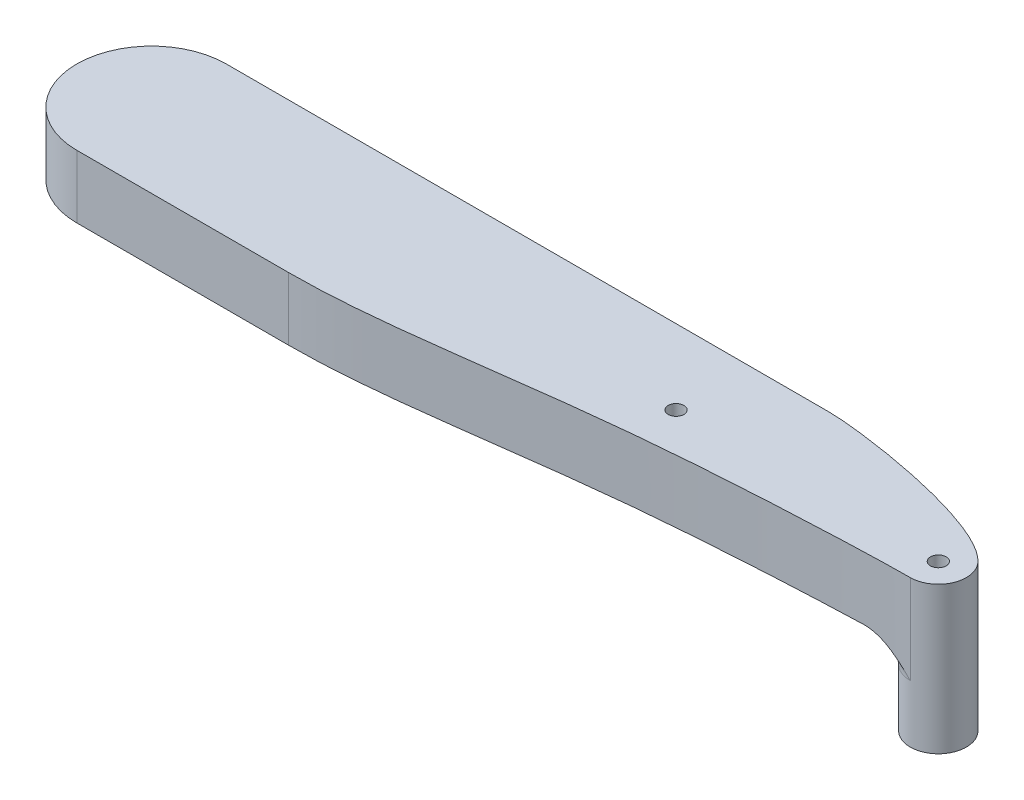
ISO-10303-21;
HEADER;
FILE_DESCRIPTION(('STEP AP214'),'2;1');
FILE_NAME('part.step','',(''),(''),'','','');
FILE_SCHEMA(('AUTOMOTIVE_DESIGN { 1 0 10303 214 1 1 1 1 }'));
ENDSEC;
DATA;
#1=APPLICATION_CONTEXT('core data for automotive mechanical design processes');
#2=APPLICATION_PROTOCOL_DEFINITION('international standard','automotive_design',2000,#1);
#3=PRODUCT_CONTEXT('',#1,'mechanical');
#4=PRODUCT('Part','Part','',(#3));
#5=PRODUCT_RELATED_PRODUCT_CATEGORY('part','',(#4));
#6=PRODUCT_DEFINITION_FORMATION('','',#4);
#7=PRODUCT_DEFINITION_CONTEXT('part definition',#1,'design');
#8=PRODUCT_DEFINITION('design','',#6,#7);
#9=PRODUCT_DEFINITION_SHAPE('','',#8);
#10=(LENGTH_UNIT() NAMED_UNIT(*) SI_UNIT(.MILLI.,.METRE.));
#11=(NAMED_UNIT(*) PLANE_ANGLE_UNIT() SI_UNIT($,.RADIAN.));
#12=(NAMED_UNIT(*) SI_UNIT($,.STERADIAN.) SOLID_ANGLE_UNIT());
#13=UNCERTAINTY_MEASURE_WITH_UNIT(LENGTH_MEASURE(1.E-05),#10,'distance_accuracy_value','');
#14=(GEOMETRIC_REPRESENTATION_CONTEXT(3) GLOBAL_UNCERTAINTY_ASSIGNED_CONTEXT((#13)) GLOBAL_UNIT_ASSIGNED_CONTEXT((#10,
#11,#12)) REPRESENTATION_CONTEXT('',''));
#15=CARTESIAN_POINT('',(0.,0.,0.));
#16=DIRECTION('',(0.,0.,1.));
#17=DIRECTION('',(1.,0.,0.));
#18=AXIS2_PLACEMENT_3D('',#15,#16,#17);
#19=CARTESIAN_POINT('',(-75.,12.,-14.25));
#20=DIRECTION('',(0.,0.,1.));
#21=DIRECTION('',(-1.,0.,0.));
#22=AXIS2_PLACEMENT_3D('',#19,#20,#21);
#23=PLANE('',#22);
#24=DIRECTION('',(0.,-1.,0.));
#25=VECTOR('',#24,1.);
#26=CARTESIAN_POINT('',(39.9337685956905,12.001,-14.25));
#27=LINE('',#26,#25);
#28=CARTESIAN_POINT('',(39.9337685956905,12.,-14.25));
#29=VERTEX_POINT('',#28);
#30=CARTESIAN_POINT('',(39.9337685956905,0.,-14.25));
#31=VERTEX_POINT('',#30);
#32=EDGE_CURVE('E126',#29,#31,#27,.T.);
#33=ORIENTED_EDGE('',*,*,#32,.T.);
#34=DIRECTION('',(1.,0.,0.));
#35=VECTOR('',#34,1.);
#36=CARTESIAN_POINT('',(-75.,0.,-14.25));
#37=LINE('',#36,#35);
#38=CARTESIAN_POINT('',(-75.,0.,-14.25));
#39=VERTEX_POINT('',#38);
#40=EDGE_CURVE('E144',#39,#31,#37,.T.);
#41=ORIENTED_EDGE('',*,*,#40,.F.);
#42=DIRECTION('',(0.,-1.,0.));
#43=VECTOR('',#42,1.);
#44=CARTESIAN_POINT('',(-75.,12.,-14.25));
#45=LINE('',#44,#43);
#46=CARTESIAN_POINT('',(-75.,12.,-14.25));
#47=VERTEX_POINT('',#46);
#48=EDGE_CURVE('E136',#47,#39,#45,.T.);
#49=ORIENTED_EDGE('',*,*,#48,.F.);
#50=DIRECTION('',(1.,0.,0.));
#51=VECTOR('',#50,1.);
#52=CARTESIAN_POINT('',(-75.,12.,-14.25));
#53=LINE('',#52,#51);
#54=EDGE_CURVE('E134',#47,#29,#53,.T.);
#55=ORIENTED_EDGE('',*,*,#54,.T.);
#56=EDGE_LOOP('',(#33,#41,#49,#55));
#57=FACE_BOUND('',#56,.T.);
#58=ADVANCED_FACE('F43',(#57),#23,.F.);
#59=CARTESIAN_POINT('',(-75.,12.,14.25));
#60=DIRECTION('',(0.,0.,1.));
#61=DIRECTION('',(-1.,0.,0.));
#62=AXIS2_PLACEMENT_3D('',#59,#60,#61);
#63=PLANE('',#62);
#64=DIRECTION('',(1.,0.,0.));
#65=VECTOR('',#64,1.);
#66=CARTESIAN_POINT('',(-75.,12.,14.25));
#67=LINE('',#66,#65);
#68=CARTESIAN_POINT('',(-75.,12.,14.25));
#69=VERTEX_POINT('',#68);
#70=CARTESIAN_POINT('',(-34.5980224377259,12.,14.25));
#71=VERTEX_POINT('',#70);
#72=EDGE_CURVE('E123',#69,#71,#67,.T.);
#73=ORIENTED_EDGE('',*,*,#72,.F.);
#74=DIRECTION('',(0.,-1.,0.));
#75=VECTOR('',#74,1.);
#76=CARTESIAN_POINT('',(-75.,12.,14.25));
#77=LINE('',#76,#75);
#78=CARTESIAN_POINT('',(-75.,0.,14.25));
#79=VERTEX_POINT('',#78);
#80=EDGE_CURVE('E133',#69,#79,#77,.T.);
#81=ORIENTED_EDGE('',*,*,#80,.T.);
#82=DIRECTION('',(1.,0.,0.));
#83=VECTOR('',#82,1.);
#84=CARTESIAN_POINT('',(-75.,0.,14.25));
#85=LINE('',#84,#83);
#86=CARTESIAN_POINT('',(-34.5980224377259,0.,14.25));
#87=VERTEX_POINT('',#86);
#88=EDGE_CURVE('E125',#79,#87,#85,.T.);
#89=ORIENTED_EDGE('',*,*,#88,.T.);
#90=DIRECTION('',(0.,-1.,0.));
#91=VECTOR('',#90,1.);
#92=CARTESIAN_POINT('',(-34.5980224377259,12.001,14.25));
#93=LINE('',#92,#91);
#94=EDGE_CURVE('E109',#71,#87,#93,.T.);
#95=ORIENTED_EDGE('',*,*,#94,.F.);
#96=EDGE_LOOP('',(#73,#81,#89,#95));
#97=FACE_BOUND('',#96,.T.);
#98=ADVANCED_FACE('F121',(#97),#63,.T.);
#99=CARTESIAN_POINT('',(-75.,0.,0.));
#100=DIRECTION('',(0.,1.,0.));
#101=DIRECTION('',(0.,0.,-1.));
#102=AXIS2_PLACEMENT_3D('',#99,#100,#101);
#103=PLANE('',#102);
#104=CARTESIAN_POINT('',(25.,0.,0.));
#105=DIRECTION('',(0.,-1.,0.));
#106=DIRECTION('',(0.,0.,-1.));
#107=AXIS2_PLACEMENT_3D('',#104,#105,#106);
#108=CIRCLE('',#107,1.5);
#109=CARTESIAN_POINT('',(25.,0.,-1.5));
#110=VERTEX_POINT('',#109);
#111=EDGE_CURVE('E145',#110,#110,#108,.T.);
#112=ORIENTED_EDGE('',*,*,#111,.F.);
#113=EDGE_LOOP('',(#112));
#114=FACE_BOUND('',#113,.T.);
#115=CARTESIAN_POINT('',(-34.5980224377259,0.,14.25));
#116=CARTESIAN_POINT('',(-16.7114247665398,0.,14.25));
#117=CARTESIAN_POINT('',(16.9697721095391,0.,7.11576395128839));
#118=CARTESIAN_POINT('',(68.5171140852767,0.,5.35000000000002));
#119=CARTESIAN_POINT('',(75.,0.,5.35000000000002));
#120=B_SPLINE_CURVE_WITH_KNOTS('',3,(#115,#116,#117,#118,#119),.UNSPECIFIED.,.F.,.F.,(4,1,4),
(0.,0.557363476483602,1.),.UNSPECIFIED.);
#121=CARTESIAN_POINT('',(66.2551672184016,0.,5.53628030557362));
#122=VERTEX_POINT('',#121);
#123=EDGE_CURVE('E181',#87,#122,#120,.T.);
#124=ORIENTED_EDGE('',*,*,#123,.F.);
#125=ORIENTED_EDGE('',*,*,#88,.F.);
#126=CARTESIAN_POINT('',(-75.,0.,0.));
#127=DIRECTION('',(0.,-1.,0.));
#128=DIRECTION('',(0.,0.,-1.));
#129=AXIS2_PLACEMENT_3D('',#126,#127,#128);
#130=CIRCLE('',#129,14.25);
#131=EDGE_CURVE('E142',#79,#39,#130,.T.);
#132=ORIENTED_EDGE('',*,*,#131,.T.);
#133=ORIENTED_EDGE('',*,*,#40,.T.);
#134=CARTESIAN_POINT('',(78.8479561308971,0.,-3.71695219429728));
#135=CARTESIAN_POINT('',(76.072393782244,0.,-6.5903392054546));
#136=CARTESIAN_POINT('',(61.3499696988219,0.,-12.0828531777784));
#137=CARTESIAN_POINT('',(43.7106323264205,0.,-14.25));
#138=CARTESIAN_POINT('',(39.9337685956905,0.,-14.25));
#139=B_SPLINE_CURVE_WITH_KNOTS('',3,(#134,#135,#136,#137,#138),.UNSPECIFIED.,.F.,.F.,(4,1,4),
(0.,0.424659955547958,1.),.UNSPECIFIED.);
#140=CARTESIAN_POINT('',(69.4691233137273,0.,-8.74825142992844));
#141=VERTEX_POINT('',#140);
#142=EDGE_CURVE('E174',#141,#31,#139,.T.);
#143=ORIENTED_EDGE('',*,*,#142,.F.);
#144=CARTESIAN_POINT('',(75.,0.,0.));
#145=DIRECTION('',(0.,-1.,0.));
#146=DIRECTION('',(0.,0.,-1.));
#147=AXIS2_PLACEMENT_3D('',#144,#145,#146);
#148=CIRCLE('',#147,10.35);
#149=EDGE_CURVE('E153',#122,#141,#148,.T.);
#150=ORIENTED_EDGE('',*,*,#149,.F.);
#151=EDGE_LOOP('',(#124,#125,#132,#133,#143,#150));
#152=FACE_BOUND('',#151,.T.);
#153=ADVANCED_FACE('F220',(#114,#152),#103,.F.);
#154=CARTESIAN_POINT('',(-75.,12.,0.));
#155=DIRECTION('',(0.,-1.,0.));
#156=DIRECTION('',(0.,0.,1.));
#157=AXIS2_PLACEMENT_3D('',#154,#155,#156);
#158=CYLINDRICAL_SURFACE('',#157,14.25);
#159=ORIENTED_EDGE('',*,*,#131,.F.);
#160=ORIENTED_EDGE('',*,*,#80,.F.);
#161=CARTESIAN_POINT('',(-75.,12.,0.));
#162=DIRECTION('',(0.,-1.,0.));
#163=DIRECTION('',(0.,0.,-1.));
#164=AXIS2_PLACEMENT_3D('',#161,#162,#163);
#165=CIRCLE('',#164,14.25);
#166=EDGE_CURVE('E131',#69,#47,#165,.T.);
#167=ORIENTED_EDGE('',*,*,#166,.T.);
#168=ORIENTED_EDGE('',*,*,#48,.T.);
#169=EDGE_LOOP('',(#159,#160,#167,#168));
#170=FACE_BOUND('',#169,.T.);
#171=ADVANCED_FACE('F212',(#170),#158,.T.);
#172=CARTESIAN_POINT('',(-75.,12.,0.));
#173=DIRECTION('',(0.,1.,0.));
#174=DIRECTION('',(0.,0.,-1.));
#175=AXIS2_PLACEMENT_3D('',#172,#173,#174);
#176=PLANE('',#175);
#177=ORIENTED_EDGE('',*,*,#54,.F.);
#178=ORIENTED_EDGE('',*,*,#166,.F.);
#179=ORIENTED_EDGE('',*,*,#72,.T.);
#180=CARTESIAN_POINT('',(-34.5980224377259,12.,14.25));
#181=CARTESIAN_POINT('',(-16.7114247665398,12.,14.25));
#182=CARTESIAN_POINT('',(16.9697721095391,12.,7.11576395128839));
#183=CARTESIAN_POINT('',(68.5171140852767,12.,5.35000000000002));
#184=CARTESIAN_POINT('',(75.,12.,5.35000000000002));
#185=B_SPLINE_CURVE_WITH_KNOTS('',3,(#180,#181,#182,#183,#184),.UNSPECIFIED.,.F.,.F.,(4,1,4),
(0.,0.557363476483602,1.),.UNSPECIFIED.);
#186=CARTESIAN_POINT('',(75.,12.,5.35000000000002));
#187=VERTEX_POINT('',#186);
#188=EDGE_CURVE('E105',#71,#187,#185,.T.);
#189=ORIENTED_EDGE('',*,*,#188,.T.);
#190=CARTESIAN_POINT('',(75.,12.,0.));
#191=DIRECTION('',(0.,-1.,0.));
#192=DIRECTION('',(0.,0.,-1.));
#193=AXIS2_PLACEMENT_3D('',#190,#191,#192);
#194=CIRCLE('',#193,5.35);
#195=CARTESIAN_POINT('',(78.8479561308971,12.,-3.71695219429727));
#196=VERTEX_POINT('',#195);
#197=EDGE_CURVE('E193',#196,#187,#194,.T.);
#198=ORIENTED_EDGE('',*,*,#197,.F.);
#199=CARTESIAN_POINT('',(78.8479561308971,12.,-3.71695219429728));
#200=CARTESIAN_POINT('',(76.072393782244,12.,-6.5903392054546));
#201=CARTESIAN_POINT('',(61.3499696988219,12.,-12.0828531777784));
#202=CARTESIAN_POINT('',(43.7106323264205,12.,-14.25));
#203=CARTESIAN_POINT('',(39.9337685956905,12.,-14.25));
#204=B_SPLINE_CURVE_WITH_KNOTS('',3,(#199,#200,#201,#202,#203),.UNSPECIFIED.,.F.,.F.,(4,1,4),
(0.,0.424659955547958,1.),.UNSPECIFIED.);
#205=EDGE_CURVE('E117',#196,#29,#204,.T.);
#206=ORIENTED_EDGE('',*,*,#205,.T.);
#207=EDGE_LOOP('',(#177,#178,#179,#189,#198,#206));
#208=FACE_BOUND('',#207,.T.);
#209=CARTESIAN_POINT('',(25.,12.,0.));
#210=DIRECTION('',(0.,-1.,0.));
#211=DIRECTION('',(0.,0.,-1.));
#212=AXIS2_PLACEMENT_3D('',#209,#210,#211);
#213=CIRCLE('',#212,1.5);
#214=CARTESIAN_POINT('',(25.,12.,-1.5));
#215=VERTEX_POINT('',#214);
#216=EDGE_CURVE('E207',#215,#215,#213,.T.);
#217=ORIENTED_EDGE('',*,*,#216,.T.);
#218=EDGE_LOOP('',(#217));
#219=FACE_BOUND('',#218,.T.);
#220=CARTESIAN_POINT('',(75.,12.,0.));
#221=DIRECTION('',(0.,-1.,0.));
#222=DIRECTION('',(0.,0.,-1.));
#223=AXIS2_PLACEMENT_3D('',#220,#221,#222);
#224=CIRCLE('',#223,1.5);
#225=CARTESIAN_POINT('',(75.,12.,-1.49999999999997));
#226=VERTEX_POINT('',#225);
#227=EDGE_CURVE('E204',#226,#226,#224,.T.);
#228=ORIENTED_EDGE('',*,*,#227,.T.);
#229=EDGE_LOOP('',(#228));
#230=FACE_BOUND('',#229,.T.);
#231=ADVANCED_FACE('F129',(#208,#219,#230),#176,.T.);
#232=CARTESIAN_POINT('',(75.,0.,0.));
#233=DIRECTION('',(0.,1.,0.));
#234=DIRECTION('',(0.,0.,-1.));
#235=AXIS2_PLACEMENT_3D('',#232,#233,#234);
#236=CYLINDRICAL_SURFACE('',#235,1.5);
#237=ORIENTED_EDGE('',*,*,#227,.F.);
#238=EDGE_LOOP('',(#237));
#239=FACE_BOUND('',#238,.T.);
#240=CARTESIAN_POINT('',(75.,-16.,0.));
#241=DIRECTION('',(0.,1.,0.));
#242=DIRECTION('',(0.,0.,1.));
#243=AXIS2_PLACEMENT_3D('',#240,#241,#242);
#244=CIRCLE('',#243,1.5);
#245=CARTESIAN_POINT('',(75.,-16.,1.50000000000002));
#246=VERTEX_POINT('',#245);
#247=EDGE_CURVE('E198',#246,#246,#244,.T.);
#248=ORIENTED_EDGE('',*,*,#247,.F.);
#249=EDGE_LOOP('',(#248));
#250=FACE_BOUND('',#249,.T.);
#251=ADVANCED_FACE('F252',(#239,#250),#236,.F.);
#252=CARTESIAN_POINT('',(25.,0.,0.));
#253=DIRECTION('',(0.,1.,0.));
#254=DIRECTION('',(0.,0.,-1.));
#255=AXIS2_PLACEMENT_3D('',#252,#253,#254);
#256=CYLINDRICAL_SURFACE('',#255,1.5);
#257=ORIENTED_EDGE('',*,*,#111,.T.);
#258=EDGE_LOOP('',(#257));
#259=FACE_BOUND('',#258,.T.);
#260=ORIENTED_EDGE('',*,*,#216,.F.);
#261=EDGE_LOOP('',(#260));
#262=FACE_BOUND('',#261,.T.);
#263=ADVANCED_FACE('F261',(#259,#262),#256,.F.);
#264=CARTESIAN_POINT('',(75.,-16.,0.));
#265=DIRECTION('',(0.,1.,0.));
#266=DIRECTION('',(0.,0.,-1.));
#267=AXIS2_PLACEMENT_3D('',#264,#265,#266);
#268=CYLINDRICAL_SURFACE('',#267,5.35);
#269=CARTESIAN_POINT('',(75.,-16.,0.));
#270=DIRECTION('',(0.,1.,0.));
#271=DIRECTION('',(0.,0.,1.));
#272=AXIS2_PLACEMENT_3D('',#269,#270,#271);
#273=CIRCLE('',#272,5.35);
#274=CARTESIAN_POINT('',(75.,-16.,5.35000000000002));
#275=VERTEX_POINT('',#274);
#276=EDGE_CURVE('E201',#275,#275,#273,.T.);
#277=ORIENTED_EDGE('',*,*,#276,.T.);
#278=EDGE_LOOP('',(#277));
#279=FACE_BOUND('',#278,.T.);
#280=CARTESIAN_POINT('',(75.,-5.,0.));
#281=DIRECTION('',(0.,-1.,0.));
#282=DIRECTION('',(0.,0.,-1.));
#283=AXIS2_PLACEMENT_3D('',#280,#281,#282);
#284=CIRCLE('',#283,5.35);
#285=CARTESIAN_POINT('',(78.8479561308971,-5.,-3.71695219429727));
#286=VERTEX_POINT('',#285);
#287=CARTESIAN_POINT('',(75.,-5.,5.35000000000002));
#288=VERTEX_POINT('',#287);
#289=EDGE_CURVE('E151',#286,#288,#284,.F.);
#290=ORIENTED_EDGE('',*,*,#289,.F.);
#291=DIRECTION('',(0.,-1.,0.));
#292=VECTOR('',#291,1.);
#293=CARTESIAN_POINT('',(78.8479561308971,12.001,-3.71695219429727));
#294=LINE('',#293,#292);
#295=EDGE_CURVE('E188',#196,#286,#294,.T.);
#296=ORIENTED_EDGE('',*,*,#295,.F.);
#297=ORIENTED_EDGE('',*,*,#197,.T.);
#298=DIRECTION('',(0.,-1.,0.));
#299=VECTOR('',#298,1.);
#300=CARTESIAN_POINT('',(75.,12.001,5.35000000000002));
#301=LINE('',#300,#299);
#302=EDGE_CURVE('E112',#187,#288,#301,.T.);
#303=ORIENTED_EDGE('',*,*,#302,.T.);
#304=EDGE_LOOP('',(#290,#296,#297,#303));
#305=FACE_BOUND('',#304,.T.);
#306=ADVANCED_FACE('F223',(#279,#305),#268,.T.);
#307=CARTESIAN_POINT('',(75.,-16.,0.));
#308=DIRECTION('',(0.,-1.,0.));
#309=DIRECTION('',(0.,0.,1.));
#310=AXIS2_PLACEMENT_3D('',#307,#308,#309);
#311=PLANE('',#310);
#312=ORIENTED_EDGE('',*,*,#247,.T.);
#313=EDGE_LOOP('',(#312));
#314=FACE_BOUND('',#313,.T.);
#315=ORIENTED_EDGE('',*,*,#276,.F.);
#316=EDGE_LOOP('',(#315));
#317=FACE_BOUND('',#316,.T.);
#318=ADVANCED_FACE('F235',(#314,#317),#311,.T.);
#319=CARTESIAN_POINT('',(78.8479561308971,12.001,-3.71695219429728));
#320=CARTESIAN_POINT('',(76.072393782244,12.001,-6.5903392054546));
#321=CARTESIAN_POINT('',(61.3499696988219,12.001,-12.0828531777784));
#322=CARTESIAN_POINT('',(43.7106323264205,12.001,-14.25));
#323=CARTESIAN_POINT('',(39.9337685956905,12.001,-14.25));
#324=B_SPLINE_CURVE_WITH_KNOTS('',3,(#319,#320,#321,#322,#323),.UNSPECIFIED.,.F.,.F.,(4,1,4),
(0.,0.424659955547958,1.),.UNSPECIFIED.);
#325=DIRECTION('',(0.,-1.,0.));
#326=VECTOR('',#325,1.);
#327=SURFACE_OF_LINEAR_EXTRUSION('',#324,#326);
#328=ORIENTED_EDGE('',*,*,#205,.F.);
#329=ORIENTED_EDGE('',*,*,#295,.T.);
#330=CARTESIAN_POINT('',(69.4691233137273,0.,-8.74825142992843));
#331=CARTESIAN_POINT('',(69.7162407882264,1.27748011091491E-05,-8.66245437018297));
#332=CARTESIAN_POINT('',(69.9626078338025,-0.0125491171101159,-8.57509437040522));
#333=CARTESIAN_POINT('',(70.4517020973886,-0.0605992398903098,-8.39780159957841));
#334=CARTESIAN_POINT('',(70.6944349001199,-0.0960475630020573,-8.30787356687412));
#335=CARTESIAN_POINT('',(71.1718444173535,-0.187062457598607,-8.12689029729057));
#336=CARTESIAN_POINT('',(71.4065850184386,-0.242359307323189,-8.03586527413635));
#337=CARTESIAN_POINT('',(71.8703242354997,-0.371039394806172,-7.8517552221786));
#338=CARTESIAN_POINT('',(72.0993197194226,-0.444432271604425,-7.75866911965019));
#339=CARTESIAN_POINT('',(72.6748784578809,-0.651986117625764,-7.51888775781214));
#340=CARTESIAN_POINT('',(73.0168554919735,-0.797371556090458,-7.37085778621923));
#341=CARTESIAN_POINT('',(73.6837880315597,-1.11900178064738,-7.07018502336126));
#342=CARTESIAN_POINT('',(74.0087346410546,-1.29526249004818,-6.91753988569));
#343=CARTESIAN_POINT('',(74.6434955543206,-1.67234957347352,-6.60592836092764));
#344=CARTESIAN_POINT('',(74.9532186930552,-1.87330343210536,-6.44693229645302));
#345=CARTESIAN_POINT('',(75.5568759828669,-2.291814993449,-6.12150429630458));
#346=CARTESIAN_POINT('',(75.850813750054,-2.5093688655501,-5.95507407978499));
#347=CARTESIAN_POINT('',(76.3796138184036,-2.91895253401366,-5.63853837748133));
#348=CARTESIAN_POINT('',(76.6164869748887,-3.10960306354093,-5.48999244960288));
#349=CARTESIAN_POINT('',(76.9649894689781,-3.39705063835772,-5.25933946851095));
#350=CARTESIAN_POINT('',(77.0799359553168,-3.49303682017952,-5.18121304727206));
#351=CARTESIAN_POINT('',(77.307712832565,-3.68492409096172,-5.02182045700913));
#352=CARTESIAN_POINT('',(77.4205432164099,-3.78082517963704,-4.94055427750591));
#353=CARTESIAN_POINT('',(77.6332741862818,-3.96259175822093,-4.7823744715794));
#354=CARTESIAN_POINT('',(77.7333676662828,-4.04852867841373,-4.70580286732044));
#355=CARTESIAN_POINT('',(77.9318084990138,-4.21919635947782,-4.54913752120373));
#356=CARTESIAN_POINT('',(78.0301559521037,-4.30392718961809,-4.46904398270926));
#357=CARTESIAN_POINT('',(78.2249537480498,-4.47149372823837,-4.30477466558012));
#358=CARTESIAN_POINT('',(78.3214048379901,-4.55433018520525,-4.22060054172295));
#359=CARTESIAN_POINT('',(78.5122076748596,-4.71734715723398,-4.04745761662876));
#360=CARTESIAN_POINT('',(78.606559870034,-4.79752824120682,-3.9584898532958));
#361=CARTESIAN_POINT('',(78.7444834165403,-4.91361799664659,-3.8225329672382));
#362=CARTESIAN_POINT('',(78.7890128150392,-4.95092092450582,-3.77770258462865));
#363=CARTESIAN_POINT('',(78.8381365202134,-4.99183054162905,-3.72710495154757));
#364=CARTESIAN_POINT('',(78.8430483354553,-4.99591832816959,-3.72203296145491));
#365=CARTESIAN_POINT('',(78.8479561308971,-5.,-3.71695219429726));
#366=B_SPLINE_CURVE_WITH_KNOTS('',3,(#330,#331,#332,#333,#334,#335,#336,#337,#338,#339,#340,
#341,#342,#343,#344,#345,#346,#347,#348,#349,#350,#351,#352,#353,#354,#355,#356,#357,#358,#359,
#360,#361,#362,#363,#364,#365),.UNSPECIFIED.,.F.,.F.,(4,2,2,2,2,2,2,2,2,2,2,2,2,2,2,2,2,4),(0.,
0.784171888016417,1.56698007158625,2.33953014215324,3.11249261204732,4.31045412731763,
5.5090352963167,6.71408720536129,7.91886187335516,8.93381135105614,9.44050116631549,
9.9471926728375,10.4047534731171,10.8622878875554,11.3196382878075,11.7768900588009,
11.9969988565836,12.0214743085638),.UNSPECIFIED.);
#367=EDGE_CURVE('E11',#141,#286,#366,.T.);
#368=ORIENTED_EDGE('',*,*,#367,.F.);
#369=ORIENTED_EDGE('',*,*,#142,.T.);
#370=ORIENTED_EDGE('',*,*,#32,.F.);
#371=EDGE_LOOP('',(#328,#329,#368,#369,#370));
#372=FACE_BOUND('',#371,.T.);
#373=ADVANCED_FACE('F162',(#372),#327,.F.);
#374=CARTESIAN_POINT('',(-34.5980224377259,12.001,14.25));
#375=CARTESIAN_POINT('',(-16.7114247665398,12.001,14.25));
#376=CARTESIAN_POINT('',(16.9697721095391,12.001,7.11576395128839));
#377=CARTESIAN_POINT('',(68.5171140852767,12.001,5.35000000000002));
#378=CARTESIAN_POINT('',(75.,12.001,5.35000000000002));
#379=B_SPLINE_CURVE_WITH_KNOTS('',3,(#374,#375,#376,#377,#378),.UNSPECIFIED.,.F.,.F.,(4,1,4),
(0.,0.557363476483602,1.),.UNSPECIFIED.);
#380=DIRECTION('',(0.,-1.,0.));
#381=VECTOR('',#380,1.);
#382=SURFACE_OF_LINEAR_EXTRUSION('',#379,#381);
#383=ORIENTED_EDGE('',*,*,#188,.F.);
#384=ORIENTED_EDGE('',*,*,#94,.T.);
#385=ORIENTED_EDGE('',*,*,#123,.T.);
#386=CARTESIAN_POINT('',(66.2551672184016,0.,5.53628030557362));
#387=CARTESIAN_POINT('',(66.469171831673,2.7526163092675E-05,5.52934133624696));
#388=CARTESIAN_POINT('',(66.6830549370466,-0.0102103952886642,5.52252599978187));
#389=CARTESIAN_POINT('',(67.1087483131879,-0.0497849331220507,5.50920403246953));
#390=CARTESIAN_POINT('',(67.3205612326467,-0.0790926014635715,5.5026969497263));
#391=CARTESIAN_POINT('',(67.7384270571091,-0.154926514796708,5.49010736517336));
#392=CARTESIAN_POINT('',(67.944518556504,-0.201242564127938,5.48402071511977));
#393=CARTESIAN_POINT('',(68.352578429492,-0.309675501481573,5.47221630833354));
#394=CARTESIAN_POINT('',(68.5545447666986,-0.371799998976676,5.46649873092214));
#395=CARTESIAN_POINT('',(69.0330971758725,-0.537997136532007,5.45325233210289));
#396=CARTESIAN_POINT('',(69.3073184984908,-0.648918143188869,5.44591058454164));
#397=CARTESIAN_POINT('',(69.8448032783703,-0.894670916389738,5.43201873464776));
#398=CARTESIAN_POINT('',(70.1080631275786,-1.02951048027828,5.42546889164696));
#399=CARTESIAN_POINT('',(70.6245680152153,-1.31988739492585,5.41313052751293));
#400=CARTESIAN_POINT('',(70.8777566397963,-1.47552449365025,5.40734596092998));
#401=CARTESIAN_POINT('',(71.3732791139093,-1.8033382062679,5.39656186574452));
#402=CARTESIAN_POINT('',(71.6156078060463,-1.9755225589412,5.39156270736782));
#403=CARTESIAN_POINT('',(72.1349079191348,-2.36653434578184,5.38147489203614));
#404=CARTESIAN_POINT('',(72.4098450834117,-2.58805068278525,5.37654553585045));
#405=CARTESIAN_POINT('',(72.9482826071423,-3.04443210284386,5.36779391501464));
#406=CARTESIAN_POINT('',(73.2117830018426,-3.27929714475501,5.36397164695241));
#407=CARTESIAN_POINT('',(73.7302346768364,-3.75760414501523,5.35753758705819));
#408=CARTESIAN_POINT('',(73.9851957682214,-4.00103555179908,5.3549243585361));
#409=CARTESIAN_POINT('',(74.4903377558122,-4.4927358075824,5.3511711122058));
#410=CARTESIAN_POINT('',(74.7405190309079,-4.7410042699772,5.35003097714602));
#411=CARTESIAN_POINT('',(74.9933159973708,-4.99332774686762,5.35000021487235));
#412=CARTESIAN_POINT('',(74.9966580619035,-4.99666381094927,5.35000000738095));
#413=CARTESIAN_POINT('',(75.,-5.,5.35000000000003));
#414=B_SPLINE_CURVE_WITH_KNOTS('',3,(#386,#387,#388,#389,#390,#391,#392,#393,#394,#395,#396,
#397,#398,#399,#400,#401,#402,#403,#404,#405,#406,#407,#408,#409,#410,#411,#412,#413),
.UNSPECIFIED.,.F.,.F.,(4,2,2,2,2,2,2,2,2,2,2,2,2,4),(0.,0.641922934771606,1.28287369122424,
1.91615619906444,2.54974411903925,3.43602215968588,4.32258965584178,5.21357303967188,
6.10497516330829,7.16367992520422,8.2223814240844,9.27982162637577,10.3371776560255,
10.3513441117543),.UNSPECIFIED.);
#415=EDGE_CURVE('E57',#288,#122,#414,.F.);
#416=ORIENTED_EDGE('',*,*,#415,.F.);
#417=ORIENTED_EDGE('',*,*,#302,.F.);
#418=EDGE_LOOP('',(#383,#384,#385,#416,#417));
#419=FACE_BOUND('',#418,.T.);
#420=ADVANCED_FACE('F107',(#419),#382,.F.);
#421=CARTESIAN_POINT('',(75.,-5.,0.));
#422=DIRECTION('',(0.,1.,0.));
#423=DIRECTION('',(0.,0.,-1.));
#424=AXIS2_PLACEMENT_3D('',#421,#422,#423);
#425=TOROIDAL_SURFACE('',#424,10.35,5.);
#426=ORIENTED_EDGE('',*,*,#367,.T.);
#427=ORIENTED_EDGE('',*,*,#289,.T.);
#428=ORIENTED_EDGE('',*,*,#415,.T.);
#429=ORIENTED_EDGE('',*,*,#149,.T.);
#430=EDGE_LOOP('',(#426,#427,#428,#429));
#431=FACE_BOUND('',#430,.T.);
#432=ADVANCED_FACE('F45',(#431),#425,.F.);
#433=CLOSED_SHELL('',(#58,#98,#153,#171,#231,#251,#263,#306,#318,#373,#420,#432));
#434=MANIFOLD_SOLID_BREP('B2',#433);
#435=ADVANCED_BREP_SHAPE_REPRESENTATION('',(#18,#434),#14);
#436=SHAPE_DEFINITION_REPRESENTATION(#9,#435);
ENDSEC;
END-ISO-10303-21;
